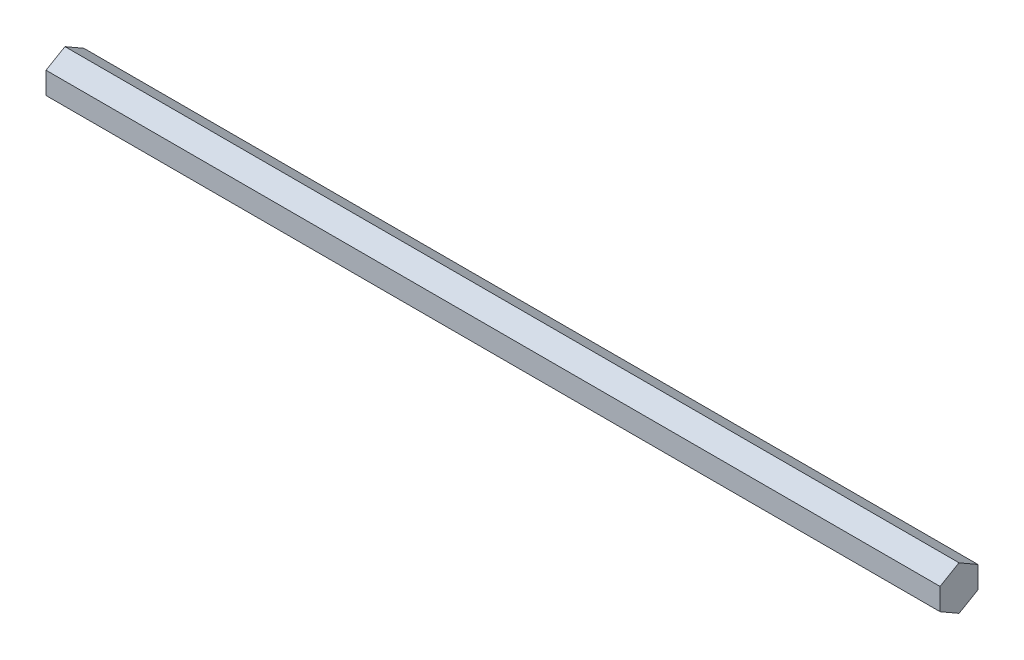
ISO-10303-21;
HEADER;
FILE_DESCRIPTION(('STEP AP214'),'2;1');
FILE_NAME('part.step','',(''),(''),'','','');
FILE_SCHEMA(('AUTOMOTIVE_DESIGN { 1 0 10303 214 1 1 1 1 }'));
ENDSEC;
DATA;
#1=APPLICATION_CONTEXT('core data for automotive mechanical design processes');
#2=APPLICATION_PROTOCOL_DEFINITION('international standard','automotive_design',2000,#1);
#3=PRODUCT_CONTEXT('',#1,'mechanical');
#4=PRODUCT('Part','Part','',(#3));
#5=PRODUCT_RELATED_PRODUCT_CATEGORY('part','',(#4));
#6=PRODUCT_DEFINITION_FORMATION('','',#4);
#7=PRODUCT_DEFINITION_CONTEXT('part definition',#1,'design');
#8=PRODUCT_DEFINITION('design','',#6,#7);
#9=PRODUCT_DEFINITION_SHAPE('','',#8);
#10=(LENGTH_UNIT() NAMED_UNIT(*) SI_UNIT(.MILLI.,.METRE.));
#11=(NAMED_UNIT(*) PLANE_ANGLE_UNIT() SI_UNIT($,.RADIAN.));
#12=(NAMED_UNIT(*) SI_UNIT($,.STERADIAN.) SOLID_ANGLE_UNIT());
#13=UNCERTAINTY_MEASURE_WITH_UNIT(LENGTH_MEASURE(1.E-05),#10,'distance_accuracy_value','');
#14=(GEOMETRIC_REPRESENTATION_CONTEXT(3) GLOBAL_UNCERTAINTY_ASSIGNED_CONTEXT((#13)) GLOBAL_UNIT_ASSIGNED_CONTEXT((#10,
#11,#12)) REPRESENTATION_CONTEXT('',''));
#15=CARTESIAN_POINT('',(0.,0.,0.));
#16=DIRECTION('',(0.,0.,1.));
#17=DIRECTION('',(1.,0.,0.));
#18=AXIS2_PLACEMENT_3D('',#15,#16,#17);
#19=CARTESIAN_POINT('',(194.31,-4.7625,0.));
#20=DIRECTION('',(0.,0.866025403784439,0.5));
#21=DIRECTION('',(0.,-0.5,0.866025403784439));
#22=AXIS2_PLACEMENT_3D('',#19,#20,#21);
#23=PLANE('',#22);
#24=DIRECTION('',(0.,0.499999999999999,-0.866025403784439));
#25=VECTOR('',#24,1.);
#26=CARTESIAN_POINT('',(0.,-4.7625,0.));
#27=LINE('',#26,#25);
#28=CARTESIAN_POINT('',(0.,-4.7625,0.));
#29=VERTEX_POINT('',#28);
#30=CARTESIAN_POINT('',(0.,-2.38125,-4.12444598552339));
#31=VERTEX_POINT('',#30);
#32=EDGE_CURVE('E134',#29,#31,#27,.T.);
#33=ORIENTED_EDGE('',*,*,#32,.T.);
#34=DIRECTION('',(-1.,0.,0.));
#35=VECTOR('',#34,1.);
#36=CARTESIAN_POINT('',(194.31,-2.38125,-4.12444598552339));
#37=LINE('',#36,#35);
#38=CARTESIAN_POINT('',(194.31,-2.38125,-4.12444598552339));
#39=VERTEX_POINT('',#38);
#40=EDGE_CURVE('E11',#39,#31,#37,.T.);
#41=ORIENTED_EDGE('',*,*,#40,.F.);
#42=DIRECTION('',(0.,0.499999999999999,-0.866025403784439));
#43=VECTOR('',#42,1.);
#44=CARTESIAN_POINT('',(194.31,-4.7625,0.));
#45=LINE('',#44,#43);
#46=CARTESIAN_POINT('',(194.31,-4.7625,0.));
#47=VERTEX_POINT('',#46);
#48=EDGE_CURVE('E150',#47,#39,#45,.T.);
#49=ORIENTED_EDGE('',*,*,#48,.F.);
#50=DIRECTION('',(-1.,0.,0.));
#51=VECTOR('',#50,1.);
#52=CARTESIAN_POINT('',(194.31,-4.7625,0.));
#53=LINE('',#52,#51);
#54=EDGE_CURVE('E130',#47,#29,#53,.T.);
#55=ORIENTED_EDGE('',*,*,#54,.T.);
#56=EDGE_LOOP('',(#33,#41,#49,#55));
#57=FACE_BOUND('',#56,.T.);
#58=ADVANCED_FACE('F45',(#57),#23,.F.);
#59=CARTESIAN_POINT('',(194.31,-2.38125,-4.12444598552339));
#60=DIRECTION('',(0.,0.,1.));
#61=DIRECTION('',(1.,0.,0.));
#62=AXIS2_PLACEMENT_3D('',#59,#60,#61);
#63=PLANE('',#62);
#64=DIRECTION('',(0.,1.,0.));
#65=VECTOR('',#64,1.);
#66=CARTESIAN_POINT('',(0.,-2.38125,-4.12444598552339));
#67=LINE('',#66,#65);
#68=CARTESIAN_POINT('',(0.,2.38125,-4.12444598552339));
#69=VERTEX_POINT('',#68);
#70=EDGE_CURVE('E138',#31,#69,#67,.T.);
#71=ORIENTED_EDGE('',*,*,#70,.T.);
#72=DIRECTION('',(-1.,0.,0.));
#73=VECTOR('',#72,1.);
#74=CARTESIAN_POINT('',(194.31,2.38125,-4.12444598552339));
#75=LINE('',#74,#73);
#76=CARTESIAN_POINT('',(194.31,2.38125,-4.12444598552339));
#77=VERTEX_POINT('',#76);
#78=EDGE_CURVE('E54',#77,#69,#75,.T.);
#79=ORIENTED_EDGE('',*,*,#78,.F.);
#80=DIRECTION('',(0.,1.,0.));
#81=VECTOR('',#80,1.);
#82=CARTESIAN_POINT('',(194.31,-2.38125,-4.12444598552339));
#83=LINE('',#82,#81);
#84=EDGE_CURVE('E99',#39,#77,#83,.T.);
#85=ORIENTED_EDGE('',*,*,#84,.F.);
#86=ORIENTED_EDGE('',*,*,#40,.T.);
#87=EDGE_LOOP('',(#71,#79,#85,#86));
#88=FACE_BOUND('',#87,.T.);
#89=ADVANCED_FACE('F178',(#88),#63,.F.);
#90=CARTESIAN_POINT('',(194.31,2.38125,-4.12444598552339));
#91=DIRECTION('',(0.,-0.866025403784439,0.5));
#92=DIRECTION('',(0.,-0.5,-0.866025403784439));
#93=AXIS2_PLACEMENT_3D('',#90,#91,#92);
#94=PLANE('',#93);
#95=DIRECTION('',(0.,0.5,0.866025403784439));
#96=VECTOR('',#95,1.);
#97=CARTESIAN_POINT('',(0.,2.38125,-4.12444598552339));
#98=LINE('',#97,#96);
#99=CARTESIAN_POINT('',(0.,4.7625,0.));
#100=VERTEX_POINT('',#99);
#101=EDGE_CURVE('E141',#69,#100,#98,.T.);
#102=ORIENTED_EDGE('',*,*,#101,.T.);
#103=DIRECTION('',(-1.,0.,0.));
#104=VECTOR('',#103,1.);
#105=CARTESIAN_POINT('',(194.31,4.7625,0.));
#106=LINE('',#105,#104);
#107=CARTESIAN_POINT('',(194.31,4.7625,0.));
#108=VERTEX_POINT('',#107);
#109=EDGE_CURVE('E123',#108,#100,#106,.T.);
#110=ORIENTED_EDGE('',*,*,#109,.F.);
#111=DIRECTION('',(0.,0.5,0.866025403784439));
#112=VECTOR('',#111,1.);
#113=CARTESIAN_POINT('',(194.31,2.38125,-4.12444598552339));
#114=LINE('',#113,#112);
#115=EDGE_CURVE('E112',#77,#108,#114,.T.);
#116=ORIENTED_EDGE('',*,*,#115,.F.);
#117=ORIENTED_EDGE('',*,*,#78,.T.);
#118=EDGE_LOOP('',(#102,#110,#116,#117));
#119=FACE_BOUND('',#118,.T.);
#120=ADVANCED_FACE('F160',(#119),#94,.F.);
#121=CARTESIAN_POINT('',(194.31,4.7625,0.));
#122=DIRECTION('',(0.,-0.866025403784439,-0.5));
#123=DIRECTION('',(0.,0.5,-0.866025403784439));
#124=AXIS2_PLACEMENT_3D('',#121,#122,#123);
#125=PLANE('',#124);
#126=DIRECTION('',(0.,-0.5,0.866025403784439));
#127=VECTOR('',#126,1.);
#128=CARTESIAN_POINT('',(0.,4.7625,0.));
#129=LINE('',#128,#127);
#130=CARTESIAN_POINT('',(0.,2.38125,4.12444598552339));
#131=VERTEX_POINT('',#130);
#132=EDGE_CURVE('E121',#100,#131,#129,.T.);
#133=ORIENTED_EDGE('',*,*,#132,.T.);
#134=DIRECTION('',(-1.,0.,0.));
#135=VECTOR('',#134,1.);
#136=CARTESIAN_POINT('',(194.31,2.38125,4.12444598552339));
#137=LINE('',#136,#135);
#138=CARTESIAN_POINT('',(194.31,2.38125,4.12444598552339));
#139=VERTEX_POINT('',#138);
#140=EDGE_CURVE('E118',#139,#131,#137,.T.);
#141=ORIENTED_EDGE('',*,*,#140,.F.);
#142=DIRECTION('',(0.,-0.5,0.866025403784439));
#143=VECTOR('',#142,1.);
#144=CARTESIAN_POINT('',(194.31,4.7625,0.));
#145=LINE('',#144,#143);
#146=EDGE_CURVE('E106',#108,#139,#145,.T.);
#147=ORIENTED_EDGE('',*,*,#146,.F.);
#148=ORIENTED_EDGE('',*,*,#109,.T.);
#149=EDGE_LOOP('',(#133,#141,#147,#148));
#150=FACE_BOUND('',#149,.T.);
#151=ADVANCED_FACE('F119',(#150),#125,.F.);
#152=CARTESIAN_POINT('',(194.31,2.38125,4.12444598552339));
#153=DIRECTION('',(0.,0.,-1.));
#154=DIRECTION('',(-1.,0.,0.));
#155=AXIS2_PLACEMENT_3D('',#152,#153,#154);
#156=PLANE('',#155);
#157=DIRECTION('',(0.,-1.,0.));
#158=VECTOR('',#157,1.);
#159=CARTESIAN_POINT('',(0.,2.38125,4.12444598552339));
#160=LINE('',#159,#158);
#161=CARTESIAN_POINT('',(0.,-2.38125,4.12444598552339));
#162=VERTEX_POINT('',#161);
#163=EDGE_CURVE('E85',#131,#162,#160,.T.);
#164=ORIENTED_EDGE('',*,*,#163,.T.);
#165=DIRECTION('',(-1.,0.,0.));
#166=VECTOR('',#165,1.);
#167=CARTESIAN_POINT('',(194.31,-2.38125,4.12444598552339));
#168=LINE('',#167,#166);
#169=CARTESIAN_POINT('',(194.31,-2.38125,4.12444598552339));
#170=VERTEX_POINT('',#169);
#171=EDGE_CURVE('E124',#170,#162,#168,.T.);
#172=ORIENTED_EDGE('',*,*,#171,.F.);
#173=DIRECTION('',(0.,-1.,0.));
#174=VECTOR('',#173,1.);
#175=CARTESIAN_POINT('',(194.31,2.38125,4.12444598552339));
#176=LINE('',#175,#174);
#177=EDGE_CURVE('E110',#139,#170,#176,.T.);
#178=ORIENTED_EDGE('',*,*,#177,.F.);
#179=ORIENTED_EDGE('',*,*,#140,.T.);
#180=EDGE_LOOP('',(#164,#172,#178,#179));
#181=FACE_BOUND('',#180,.T.);
#182=ADVANCED_FACE('F126',(#181),#156,.F.);
#183=CARTESIAN_POINT('',(194.31,-2.38125,4.12444598552339));
#184=DIRECTION('',(0.,0.866025403784439,-0.5));
#185=DIRECTION('',(0.,0.5,0.866025403784439));
#186=AXIS2_PLACEMENT_3D('',#183,#184,#185);
#187=PLANE('',#186);
#188=DIRECTION('',(0.,-0.5,-0.866025403784439));
#189=VECTOR('',#188,1.);
#190=CARTESIAN_POINT('',(0.,-2.38125,4.12444598552339));
#191=LINE('',#190,#189);
#192=EDGE_CURVE('E91',#162,#29,#191,.T.);
#193=ORIENTED_EDGE('',*,*,#192,.T.);
#194=ORIENTED_EDGE('',*,*,#54,.F.);
#195=DIRECTION('',(0.,-0.5,-0.866025403784439));
#196=VECTOR('',#195,1.);
#197=CARTESIAN_POINT('',(194.31,-2.38125,4.12444598552339));
#198=LINE('',#197,#196);
#199=EDGE_CURVE('E62',#170,#47,#198,.T.);
#200=ORIENTED_EDGE('',*,*,#199,.F.);
#201=ORIENTED_EDGE('',*,*,#171,.T.);
#202=EDGE_LOOP('',(#193,#194,#200,#201));
#203=FACE_BOUND('',#202,.T.);
#204=ADVANCED_FACE('F167',(#203),#187,.F.);
#205=CARTESIAN_POINT('',(194.31,0.,0.));
#206=DIRECTION('',(1.,0.,0.));
#207=DIRECTION('',(0.,0.,-1.));
#208=AXIS2_PLACEMENT_3D('',#205,#206,#207);
#209=PLANE('',#208);
#210=ORIENTED_EDGE('',*,*,#48,.T.);
#211=ORIENTED_EDGE('',*,*,#84,.T.);
#212=ORIENTED_EDGE('',*,*,#115,.T.);
#213=ORIENTED_EDGE('',*,*,#146,.T.);
#214=ORIENTED_EDGE('',*,*,#177,.T.);
#215=ORIENTED_EDGE('',*,*,#199,.T.);
#216=EDGE_LOOP('',(#210,#211,#212,#213,#214,#215));
#217=FACE_BOUND('',#216,.T.);
#218=ADVANCED_FACE('F108',(#217),#209,.T.);
#219=CARTESIAN_POINT('',(0.,0.,0.));
#220=DIRECTION('',(1.,0.,0.));
#221=DIRECTION('',(0.,0.,-1.));
#222=AXIS2_PLACEMENT_3D('',#219,#220,#221);
#223=PLANE('',#222);
#224=ORIENTED_EDGE('',*,*,#32,.F.);
#225=ORIENTED_EDGE('',*,*,#192,.F.);
#226=ORIENTED_EDGE('',*,*,#163,.F.);
#227=ORIENTED_EDGE('',*,*,#132,.F.);
#228=ORIENTED_EDGE('',*,*,#101,.F.);
#229=ORIENTED_EDGE('',*,*,#70,.F.);
#230=EDGE_LOOP('',(#224,#225,#226,#227,#228,#229));
#231=FACE_BOUND('',#230,.T.);
#232=ADVANCED_FACE('F163',(#231),#223,.F.);
#233=CLOSED_SHELL('',(#58,#89,#120,#151,#182,#204,#218,#232));
#234=MANIFOLD_SOLID_BREP('B2',#233);
#235=ADVANCED_BREP_SHAPE_REPRESENTATION('',(#18,#234),#14);
#236=SHAPE_DEFINITION_REPRESENTATION(#9,#235);
ENDSEC;
END-ISO-10303-21;
